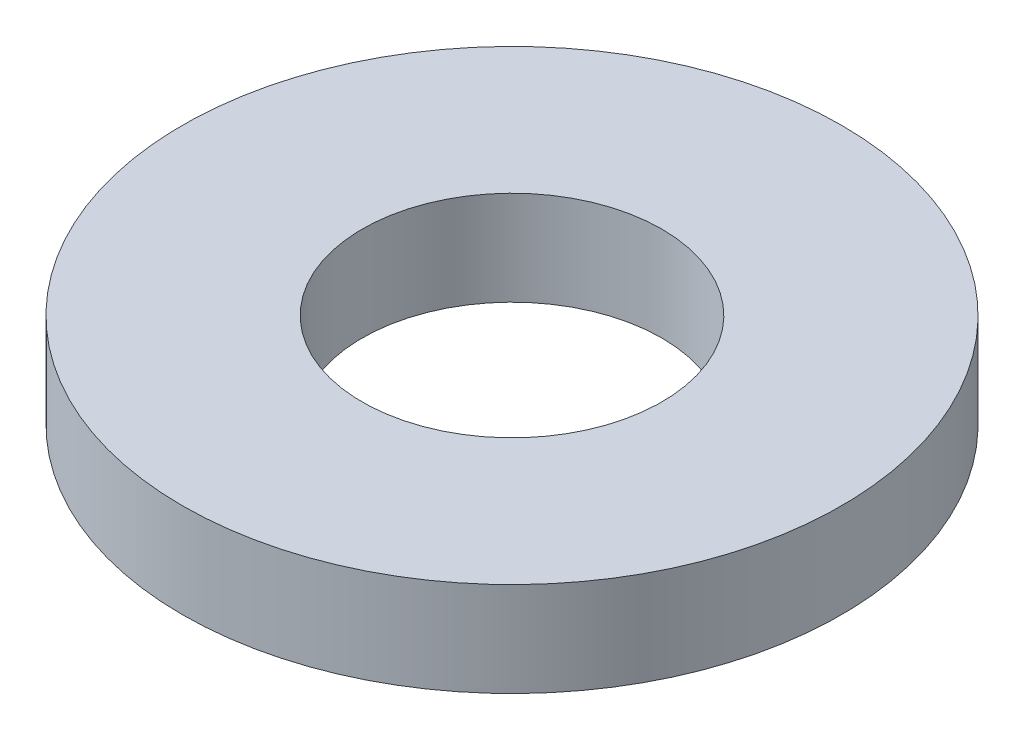
ISO-10303-21;
HEADER;
FILE_DESCRIPTION(('STEP AP214'),'2;1');
FILE_NAME('part.step','',(''),(''),'','','');
FILE_SCHEMA(('AUTOMOTIVE_DESIGN { 1 0 10303 214 1 1 1 1 }'));
ENDSEC;
DATA;
#1=APPLICATION_CONTEXT('core data for automotive mechanical design processes');
#2=APPLICATION_PROTOCOL_DEFINITION('international standard','automotive_design',2000,#1);
#3=PRODUCT_CONTEXT('',#1,'mechanical');
#4=PRODUCT('Part','Part','',(#3));
#5=PRODUCT_RELATED_PRODUCT_CATEGORY('part','',(#4));
#6=PRODUCT_DEFINITION_FORMATION('','',#4);
#7=PRODUCT_DEFINITION_CONTEXT('part definition',#1,'design');
#8=PRODUCT_DEFINITION('design','',#6,#7);
#9=PRODUCT_DEFINITION_SHAPE('','',#8);
#10=(LENGTH_UNIT() NAMED_UNIT(*) SI_UNIT(.MILLI.,.METRE.));
#11=(NAMED_UNIT(*) PLANE_ANGLE_UNIT() SI_UNIT($,.RADIAN.));
#12=(NAMED_UNIT(*) SI_UNIT($,.STERADIAN.) SOLID_ANGLE_UNIT());
#13=UNCERTAINTY_MEASURE_WITH_UNIT(LENGTH_MEASURE(1.E-05),#10,'distance_accuracy_value','');
#14=(GEOMETRIC_REPRESENTATION_CONTEXT(3) GLOBAL_UNCERTAINTY_ASSIGNED_CONTEXT((#13)) GLOBAL_UNIT_ASSIGNED_CONTEXT((#10,
#11,#12)) REPRESENTATION_CONTEXT('',''));
#15=CARTESIAN_POINT('',(0.,0.,0.));
#16=DIRECTION('',(0.,0.,1.));
#17=DIRECTION('',(1.,0.,0.));
#18=AXIS2_PLACEMENT_3D('',#15,#16,#17);
#19=CARTESIAN_POINT('',(0.,0.,0.));
#20=DIRECTION('',(0.,-1.,0.));
#21=DIRECTION('',(0.,0.,-1.));
#22=AXIS2_PLACEMENT_3D('',#19,#20,#21);
#23=CYLINDRICAL_SURFACE('',#22,2.54);
#24=CARTESIAN_POINT('',(0.,0.,0.));
#25=DIRECTION('',(0.,-1.,0.));
#26=DIRECTION('',(0.,0.,-1.));
#27=AXIS2_PLACEMENT_3D('',#24,#25,#26);
#28=CIRCLE('',#27,2.54);
#29=CARTESIAN_POINT('',(0.,0.,-2.54));
#30=VERTEX_POINT('',#29);
#31=EDGE_CURVE('E10',#30,#30,#28,.T.);
#32=ORIENTED_EDGE('',*,*,#31,.T.);
#33=EDGE_LOOP('',(#32));
#34=FACE_BOUND('',#33,.T.);
#35=CARTESIAN_POINT('',(0.,1.6002,0.));
#36=DIRECTION('',(0.,-1.,0.));
#37=DIRECTION('',(0.,0.,-1.));
#38=AXIS2_PLACEMENT_3D('',#35,#36,#37);
#39=CIRCLE('',#38,2.54);
#40=CARTESIAN_POINT('',(0.,1.6002,-2.54));
#41=VERTEX_POINT('',#40);
#42=EDGE_CURVE('E49',#41,#41,#39,.T.);
#43=ORIENTED_EDGE('',*,*,#42,.F.);
#44=EDGE_LOOP('',(#43));
#45=FACE_BOUND('',#44,.T.);
#46=ADVANCED_FACE('F35',(#34,#45),#23,.F.);
#47=CARTESIAN_POINT('',(2.54,0.,0.));
#48=DIRECTION('',(0.,-1.,0.));
#49=DIRECTION('',(0.,0.,-1.));
#50=AXIS2_PLACEMENT_3D('',#47,#48,#49);
#51=PLANE('',#50);
#52=CARTESIAN_POINT('',(0.,0.,0.));
#53=DIRECTION('',(0.,-1.,0.));
#54=DIRECTION('',(0.,0.,-1.));
#55=AXIS2_PLACEMENT_3D('',#52,#53,#54);
#56=CIRCLE('',#55,5.588);
#57=CARTESIAN_POINT('',(0.,0.,-5.588));
#58=VERTEX_POINT('',#57);
#59=EDGE_CURVE('E41',#58,#58,#56,.T.);
#60=ORIENTED_EDGE('',*,*,#59,.T.);
#61=EDGE_LOOP('',(#60));
#62=FACE_BOUND('',#61,.T.);
#63=ORIENTED_EDGE('',*,*,#31,.F.);
#64=EDGE_LOOP('',(#63));
#65=FACE_BOUND('',#64,.T.);
#66=ADVANCED_FACE('F59',(#62,#65),#51,.T.);
#67=CARTESIAN_POINT('',(0.,0.,0.));
#68=DIRECTION('',(0.,-1.,0.));
#69=DIRECTION('',(0.,0.,-1.));
#70=AXIS2_PLACEMENT_3D('',#67,#68,#69);
#71=CYLINDRICAL_SURFACE('',#70,5.588);
#72=CARTESIAN_POINT('',(0.,1.6002,0.));
#73=DIRECTION('',(0.,-1.,0.));
#74=DIRECTION('',(0.,0.,-1.));
#75=AXIS2_PLACEMENT_3D('',#72,#73,#74);
#76=CIRCLE('',#75,5.588);
#77=CARTESIAN_POINT('',(0.,1.6002,-5.588));
#78=VERTEX_POINT('',#77);
#79=EDGE_CURVE('E45',#78,#78,#76,.T.);
#80=ORIENTED_EDGE('',*,*,#79,.T.);
#81=EDGE_LOOP('',(#80));
#82=FACE_BOUND('',#81,.T.);
#83=ORIENTED_EDGE('',*,*,#59,.F.);
#84=EDGE_LOOP('',(#83));
#85=FACE_BOUND('',#84,.T.);
#86=ADVANCED_FACE('F63',(#82,#85),#71,.T.);
#87=CARTESIAN_POINT('',(2.54,1.6002,0.));
#88=DIRECTION('',(0.,1.,0.));
#89=DIRECTION('',(0.,0.,1.));
#90=AXIS2_PLACEMENT_3D('',#87,#88,#89);
#91=PLANE('',#90);
#92=ORIENTED_EDGE('',*,*,#42,.T.);
#93=EDGE_LOOP('',(#92));
#94=FACE_BOUND('',#93,.T.);
#95=ORIENTED_EDGE('',*,*,#79,.F.);
#96=EDGE_LOOP('',(#95));
#97=FACE_BOUND('',#96,.T.);
#98=ADVANCED_FACE('F55',(#94,#97),#91,.T.);
#99=CLOSED_SHELL('',(#46,#66,#86,#98));
#100=MANIFOLD_SOLID_BREP('B2',#99);
#101=ADVANCED_BREP_SHAPE_REPRESENTATION('',(#18,#100),#14);
#102=SHAPE_DEFINITION_REPRESENTATION(#9,#101);
ENDSEC;
END-ISO-10303-21;
